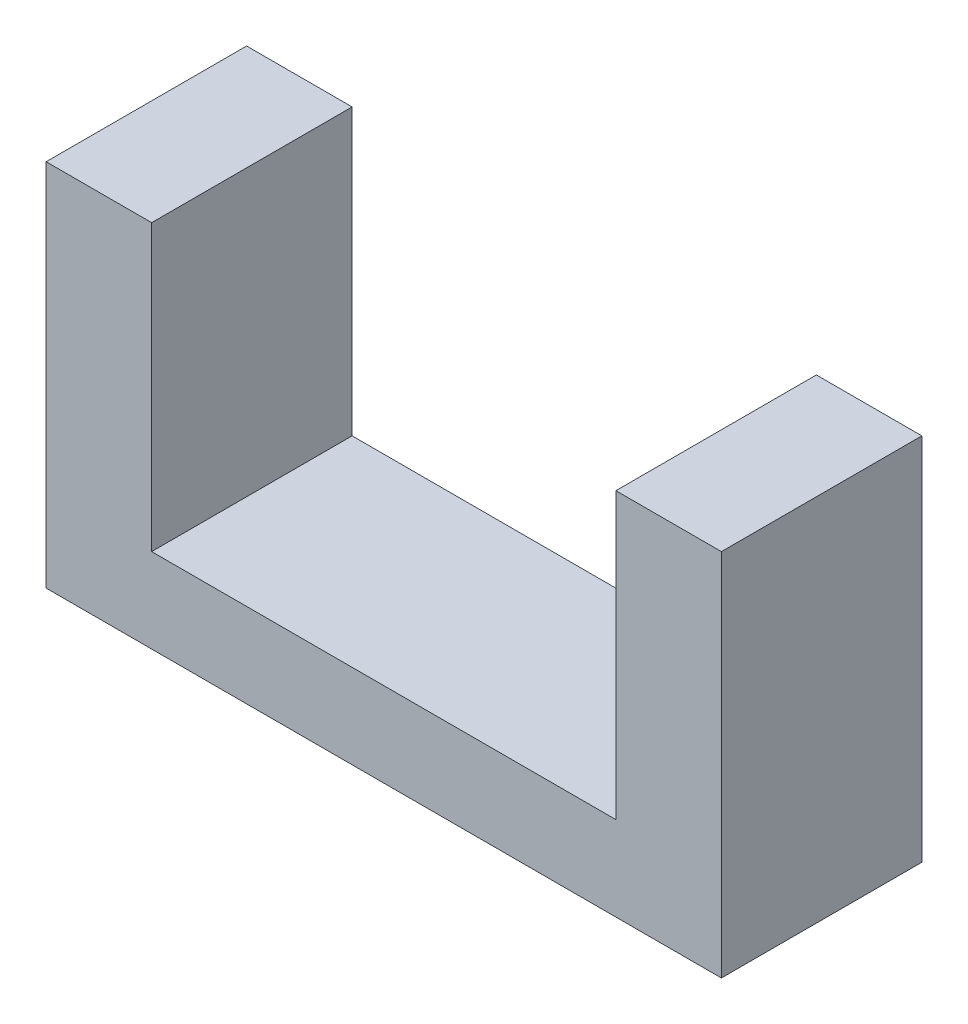
ISO-10303-21;
HEADER;
FILE_DESCRIPTION(('STEP AP214'),'2;1');
FILE_NAME('part.step','',(''),(''),'','','');
FILE_SCHEMA(('AUTOMOTIVE_DESIGN { 1 0 10303 214 1 1 1 1 }'));
ENDSEC;
DATA;
#1=APPLICATION_CONTEXT('core data for automotive mechanical design processes');
#2=APPLICATION_PROTOCOL_DEFINITION('international standard','automotive_design',2000,#1);
#3=PRODUCT_CONTEXT('',#1,'mechanical');
#4=PRODUCT('Part','Part','',(#3));
#5=PRODUCT_RELATED_PRODUCT_CATEGORY('part','',(#4));
#6=PRODUCT_DEFINITION_FORMATION('','',#4);
#7=PRODUCT_DEFINITION_CONTEXT('part definition',#1,'design');
#8=PRODUCT_DEFINITION('design','',#6,#7);
#9=PRODUCT_DEFINITION_SHAPE('','',#8);
#10=(LENGTH_UNIT() NAMED_UNIT(*) SI_UNIT(.MILLI.,.METRE.));
#11=(NAMED_UNIT(*) PLANE_ANGLE_UNIT() SI_UNIT($,.RADIAN.));
#12=(NAMED_UNIT(*) SI_UNIT($,.STERADIAN.) SOLID_ANGLE_UNIT());
#13=UNCERTAINTY_MEASURE_WITH_UNIT(LENGTH_MEASURE(1.E-05),#10,'distance_accuracy_value','');
#14=(GEOMETRIC_REPRESENTATION_CONTEXT(3) GLOBAL_UNCERTAINTY_ASSIGNED_CONTEXT((#13)) GLOBAL_UNIT_ASSIGNED_CONTEXT((#10,
#11,#12)) REPRESENTATION_CONTEXT('',''));
#15=CARTESIAN_POINT('',(0.,0.,0.));
#16=DIRECTION('',(0.,0.,1.));
#17=DIRECTION('',(1.,0.,0.));
#18=AXIS2_PLACEMENT_3D('',#15,#16,#17);
#19=CARTESIAN_POINT('',(0.,4.,0.));
#20=DIRECTION('',(0.,1.,0.));
#21=DIRECTION('',(0.,0.,1.));
#22=AXIS2_PLACEMENT_3D('',#19,#20,#21);
#23=PLANE('',#22);
#24=DIRECTION('',(1.,0.,0.));
#25=VECTOR('',#24,1.);
#26=CARTESIAN_POINT('',(0.,4.,9.5));
#27=LINE('',#26,#25);
#28=CARTESIAN_POINT('',(5.,4.,9.5));
#29=VERTEX_POINT('',#28);
#30=CARTESIAN_POINT('',(27.,4.,9.5));
#31=VERTEX_POINT('',#30);
#32=EDGE_CURVE('E53',#29,#31,#27,.T.);
#33=ORIENTED_EDGE('',*,*,#32,.T.);
#34=DIRECTION('',(0.,0.,1.));
#35=VECTOR('',#34,1.);
#36=CARTESIAN_POINT('',(27.,4.,0.));
#37=LINE('',#36,#35);
#38=CARTESIAN_POINT('',(27.,4.,0.));
#39=VERTEX_POINT('',#38);
#40=EDGE_CURVE('E48',#39,#31,#37,.T.);
#41=ORIENTED_EDGE('',*,*,#40,.F.);
#42=DIRECTION('',(-1.,0.,0.));
#43=VECTOR('',#42,1.);
#44=CARTESIAN_POINT('',(0.,4.,0.));
#45=LINE('',#44,#43);
#46=CARTESIAN_POINT('',(5.,4.,0.));
#47=VERTEX_POINT('',#46);
#48=EDGE_CURVE('E151',#39,#47,#45,.T.);
#49=ORIENTED_EDGE('',*,*,#48,.T.);
#50=DIRECTION('',(0.,0.,-1.));
#51=VECTOR('',#50,1.);
#52=CARTESIAN_POINT('',(5.,4.,0.));
#53=LINE('',#52,#51);
#54=EDGE_CURVE('E130',#29,#47,#53,.T.);
#55=ORIENTED_EDGE('',*,*,#54,.F.);
#56=EDGE_LOOP('',(#33,#41,#49,#55));
#57=FACE_BOUND('',#56,.T.);
#58=ADVANCED_FACE('F33',(#57),#23,.T.);
#59=CARTESIAN_POINT('',(0.,4.,0.));
#60=DIRECTION('',(1.,0.,0.));
#61=DIRECTION('',(0.,0.,-1.));
#62=AXIS2_PLACEMENT_3D('',#59,#60,#61);
#63=PLANE('',#62);
#64=DIRECTION('',(0.,0.,1.));
#65=VECTOR('',#64,1.);
#66=CARTESIAN_POINT('',(0.,0.,0.));
#67=LINE('',#66,#65);
#68=CARTESIAN_POINT('',(0.,0.,0.));
#69=VERTEX_POINT('',#68);
#70=CARTESIAN_POINT('',(0.,0.,9.5));
#71=VERTEX_POINT('',#70);
#72=EDGE_CURVE('E149',#69,#71,#67,.T.);
#73=ORIENTED_EDGE('',*,*,#72,.T.);
#74=DIRECTION('',(0.,-1.,0.));
#75=VECTOR('',#74,1.);
#76=CARTESIAN_POINT('',(0.,4.,9.5));
#77=LINE('',#76,#75);
#78=CARTESIAN_POINT('',(0.,17.5,9.5));
#79=VERTEX_POINT('',#78);
#80=EDGE_CURVE('E11',#79,#71,#77,.T.);
#81=ORIENTED_EDGE('',*,*,#80,.F.);
#82=DIRECTION('',(0.,0.,1.));
#83=VECTOR('',#82,1.);
#84=CARTESIAN_POINT('',(0.,17.5,0.));
#85=LINE('',#84,#83);
#86=CARTESIAN_POINT('',(0.,17.5,0.));
#87=VERTEX_POINT('',#86);
#88=EDGE_CURVE('E131',#87,#79,#85,.T.);
#89=ORIENTED_EDGE('',*,*,#88,.F.);
#90=DIRECTION('',(0.,-1.,0.));
#91=VECTOR('',#90,1.);
#92=CARTESIAN_POINT('',(0.,4.,0.));
#93=LINE('',#92,#91);
#94=EDGE_CURVE('E106',#87,#69,#93,.T.);
#95=ORIENTED_EDGE('',*,*,#94,.T.);
#96=EDGE_LOOP('',(#73,#81,#89,#95));
#97=FACE_BOUND('',#96,.T.);
#98=ADVANCED_FACE('F35',(#97),#63,.F.);
#99=CARTESIAN_POINT('',(0.,4.,9.5));
#100=DIRECTION('',(0.,0.,-1.));
#101=DIRECTION('',(-1.,0.,0.));
#102=AXIS2_PLACEMENT_3D('',#99,#100,#101);
#103=PLANE('',#102);
#104=DIRECTION('',(1.,0.,0.));
#105=VECTOR('',#104,1.);
#106=CARTESIAN_POINT('',(0.,0.,9.5));
#107=LINE('',#106,#105);
#108=CARTESIAN_POINT('',(32.,0.,9.5));
#109=VERTEX_POINT('',#108);
#110=EDGE_CURVE('E156',#71,#109,#107,.T.);
#111=ORIENTED_EDGE('',*,*,#110,.T.);
#112=DIRECTION('',(0.,-1.,0.));
#113=VECTOR('',#112,1.);
#114=CARTESIAN_POINT('',(32.,4.,9.5));
#115=LINE('',#114,#113);
#116=CARTESIAN_POINT('',(32.,17.5,9.5));
#117=VERTEX_POINT('',#116);
#118=EDGE_CURVE('E41',#117,#109,#115,.T.);
#119=ORIENTED_EDGE('',*,*,#118,.F.);
#120=DIRECTION('',(1.,0.,0.));
#121=VECTOR('',#120,1.);
#122=CARTESIAN_POINT('',(32.,17.5,9.5));
#123=LINE('',#122,#121);
#124=CARTESIAN_POINT('',(27.,17.5,9.5));
#125=VERTEX_POINT('',#124);
#126=EDGE_CURVE('E120',#125,#117,#123,.T.);
#127=ORIENTED_EDGE('',*,*,#126,.F.);
#128=DIRECTION('',(0.,-1.,0.));
#129=VECTOR('',#128,1.);
#130=CARTESIAN_POINT('',(27.,17.5,9.5));
#131=LINE('',#130,#129);
#132=EDGE_CURVE('E125',#125,#31,#131,.T.);
#133=ORIENTED_EDGE('',*,*,#132,.T.);
#134=ORIENTED_EDGE('',*,*,#32,.F.);
#135=DIRECTION('',(0.,-1.,0.));
#136=VECTOR('',#135,1.);
#137=CARTESIAN_POINT('',(5.,17.5,9.5));
#138=LINE('',#137,#136);
#139=CARTESIAN_POINT('',(5.,17.5,9.5));
#140=VERTEX_POINT('',#139);
#141=EDGE_CURVE('E146',#140,#29,#138,.T.);
#142=ORIENTED_EDGE('',*,*,#141,.F.);
#143=DIRECTION('',(1.,0.,0.));
#144=VECTOR('',#143,1.);
#145=CARTESIAN_POINT('',(0.,17.5,9.5));
#146=LINE('',#145,#144);
#147=EDGE_CURVE('E134',#79,#140,#146,.T.);
#148=ORIENTED_EDGE('',*,*,#147,.F.);
#149=ORIENTED_EDGE('',*,*,#80,.T.);
#150=EDGE_LOOP('',(#111,#119,#127,#133,#134,#142,#148,#149));
#151=FACE_BOUND('',#150,.T.);
#152=ADVANCED_FACE('F176',(#151),#103,.F.);
#153=CARTESIAN_POINT('',(32.,4.,0.));
#154=DIRECTION('',(-1.,0.,0.));
#155=DIRECTION('',(0.,0.,1.));
#156=AXIS2_PLACEMENT_3D('',#153,#154,#155);
#157=PLANE('',#156);
#158=DIRECTION('',(0.,0.,-1.));
#159=VECTOR('',#158,1.);
#160=CARTESIAN_POINT('',(32.,0.,0.));
#161=LINE('',#160,#159);
#162=CARTESIAN_POINT('',(32.,0.,0.));
#163=VERTEX_POINT('',#162);
#164=EDGE_CURVE('E103',#109,#163,#161,.T.);
#165=ORIENTED_EDGE('',*,*,#164,.T.);
#166=DIRECTION('',(0.,-1.,0.));
#167=VECTOR('',#166,1.);
#168=CARTESIAN_POINT('',(32.,4.,0.));
#169=LINE('',#168,#167);
#170=CARTESIAN_POINT('',(32.,17.5,0.));
#171=VERTEX_POINT('',#170);
#172=EDGE_CURVE('E96',#171,#163,#169,.T.);
#173=ORIENTED_EDGE('',*,*,#172,.F.);
#174=DIRECTION('',(0.,0.,-1.));
#175=VECTOR('',#174,1.);
#176=CARTESIAN_POINT('',(32.,17.5,0.));
#177=LINE('',#176,#175);
#178=EDGE_CURVE('E101',#117,#171,#177,.T.);
#179=ORIENTED_EDGE('',*,*,#178,.F.);
#180=ORIENTED_EDGE('',*,*,#118,.T.);
#181=EDGE_LOOP('',(#165,#173,#179,#180));
#182=FACE_BOUND('',#181,.T.);
#183=ADVANCED_FACE('F98',(#182),#157,.F.);
#184=CARTESIAN_POINT('',(0.,4.,0.));
#185=DIRECTION('',(0.,0.,1.));
#186=DIRECTION('',(1.,0.,0.));
#187=AXIS2_PLACEMENT_3D('',#184,#185,#186);
#188=PLANE('',#187);
#189=DIRECTION('',(-1.,0.,0.));
#190=VECTOR('',#189,1.);
#191=CARTESIAN_POINT('',(0.,0.,0.));
#192=LINE('',#191,#190);
#193=EDGE_CURVE('E152',#163,#69,#192,.T.);
#194=ORIENTED_EDGE('',*,*,#193,.T.);
#195=ORIENTED_EDGE('',*,*,#94,.F.);
#196=DIRECTION('',(-1.,0.,0.));
#197=VECTOR('',#196,1.);
#198=CARTESIAN_POINT('',(0.,17.5,0.));
#199=LINE('',#198,#197);
#200=CARTESIAN_POINT('',(5.,17.5,0.));
#201=VERTEX_POINT('',#200);
#202=EDGE_CURVE('E138',#201,#87,#199,.T.);
#203=ORIENTED_EDGE('',*,*,#202,.F.);
#204=DIRECTION('',(0.,-1.,0.));
#205=VECTOR('',#204,1.);
#206=CARTESIAN_POINT('',(5.,17.5,0.));
#207=LINE('',#206,#205);
#208=EDGE_CURVE('E141',#201,#47,#207,.T.);
#209=ORIENTED_EDGE('',*,*,#208,.T.);
#210=ORIENTED_EDGE('',*,*,#48,.F.);
#211=DIRECTION('',(0.,-1.,0.));
#212=VECTOR('',#211,1.);
#213=CARTESIAN_POINT('',(27.,17.5,0.));
#214=LINE('',#213,#212);
#215=CARTESIAN_POINT('',(27.,17.5,0.));
#216=VERTEX_POINT('',#215);
#217=EDGE_CURVE('E112',#216,#39,#214,.T.);
#218=ORIENTED_EDGE('',*,*,#217,.F.);
#219=DIRECTION('',(-1.,0.,0.));
#220=VECTOR('',#219,1.);
#221=CARTESIAN_POINT('',(32.,17.5,0.));
#222=LINE('',#221,#220);
#223=EDGE_CURVE('E109',#171,#216,#222,.T.);
#224=ORIENTED_EDGE('',*,*,#223,.F.);
#225=ORIENTED_EDGE('',*,*,#172,.T.);
#226=EDGE_LOOP('',(#194,#195,#203,#209,#210,#218,#224,#225));
#227=FACE_BOUND('',#226,.T.);
#228=ADVANCED_FACE('F110',(#227),#188,.F.);
#229=CARTESIAN_POINT('',(0.,0.,0.));
#230=DIRECTION('',(0.,1.,0.));
#231=DIRECTION('',(0.,0.,1.));
#232=AXIS2_PLACEMENT_3D('',#229,#230,#231);
#233=PLANE('',#232);
#234=ORIENTED_EDGE('',*,*,#72,.F.);
#235=ORIENTED_EDGE('',*,*,#193,.F.);
#236=ORIENTED_EDGE('',*,*,#164,.F.);
#237=ORIENTED_EDGE('',*,*,#110,.F.);
#238=EDGE_LOOP('',(#234,#235,#236,#237));
#239=FACE_BOUND('',#238,.T.);
#240=ADVANCED_FACE('F164',(#239),#233,.F.);
#241=CARTESIAN_POINT('',(5.,17.5,0.));
#242=DIRECTION('',(-1.,0.,0.));
#243=DIRECTION('',(0.,0.,1.));
#244=AXIS2_PLACEMENT_3D('',#241,#242,#243);
#245=PLANE('',#244);
#246=ORIENTED_EDGE('',*,*,#54,.T.);
#247=ORIENTED_EDGE('',*,*,#208,.F.);
#248=DIRECTION('',(0.,0.,-1.));
#249=VECTOR('',#248,1.);
#250=CARTESIAN_POINT('',(5.,17.5,0.));
#251=LINE('',#250,#249);
#252=EDGE_CURVE('E136',#140,#201,#251,.T.);
#253=ORIENTED_EDGE('',*,*,#252,.F.);
#254=ORIENTED_EDGE('',*,*,#141,.T.);
#255=EDGE_LOOP('',(#246,#247,#253,#254));
#256=FACE_BOUND('',#255,.T.);
#257=ADVANCED_FACE('F175',(#256),#245,.F.);
#258=CARTESIAN_POINT('',(0.,17.5,0.));
#259=DIRECTION('',(0.,1.,0.));
#260=DIRECTION('',(0.,0.,1.));
#261=AXIS2_PLACEMENT_3D('',#258,#259,#260);
#262=PLANE('',#261);
#263=ORIENTED_EDGE('',*,*,#88,.T.);
#264=ORIENTED_EDGE('',*,*,#147,.T.);
#265=ORIENTED_EDGE('',*,*,#252,.T.);
#266=ORIENTED_EDGE('',*,*,#202,.T.);
#267=EDGE_LOOP('',(#263,#264,#265,#266));
#268=FACE_BOUND('',#267,.T.);
#269=ADVANCED_FACE('F170',(#268),#262,.T.);
#270=CARTESIAN_POINT('',(27.,17.5,0.));
#271=DIRECTION('',(1.,0.,0.));
#272=DIRECTION('',(0.,0.,-1.));
#273=AXIS2_PLACEMENT_3D('',#270,#271,#272);
#274=PLANE('',#273);
#275=ORIENTED_EDGE('',*,*,#40,.T.);
#276=ORIENTED_EDGE('',*,*,#132,.F.);
#277=DIRECTION('',(0.,0.,1.));
#278=VECTOR('',#277,1.);
#279=CARTESIAN_POINT('',(27.,17.5,0.));
#280=LINE('',#279,#278);
#281=EDGE_CURVE('E115',#216,#125,#280,.T.);
#282=ORIENTED_EDGE('',*,*,#281,.F.);
#283=ORIENTED_EDGE('',*,*,#217,.T.);
#284=EDGE_LOOP('',(#275,#276,#282,#283));
#285=FACE_BOUND('',#284,.T.);
#286=ADVANCED_FACE('F179',(#285),#274,.F.);
#287=CARTESIAN_POINT('',(0.,17.5,0.));
#288=DIRECTION('',(0.,-1.,0.));
#289=DIRECTION('',(0.,0.,-1.));
#290=AXIS2_PLACEMENT_3D('',#287,#288,#289);
#291=PLANE('',#290);
#292=ORIENTED_EDGE('',*,*,#178,.T.);
#293=ORIENTED_EDGE('',*,*,#223,.T.);
#294=ORIENTED_EDGE('',*,*,#281,.T.);
#295=ORIENTED_EDGE('',*,*,#126,.T.);
#296=EDGE_LOOP('',(#292,#293,#294,#295));
#297=FACE_BOUND('',#296,.T.);
#298=ADVANCED_FACE('F118',(#297),#291,.F.);
#299=CLOSED_SHELL('',(#58,#98,#152,#183,#228,#240,#257,#269,#286,#298));
#300=MANIFOLD_SOLID_BREP('B2',#299);
#301=ADVANCED_BREP_SHAPE_REPRESENTATION('',(#18,#300),#14);
#302=SHAPE_DEFINITION_REPRESENTATION(#9,#301);
ENDSEC;
END-ISO-10303-21;
